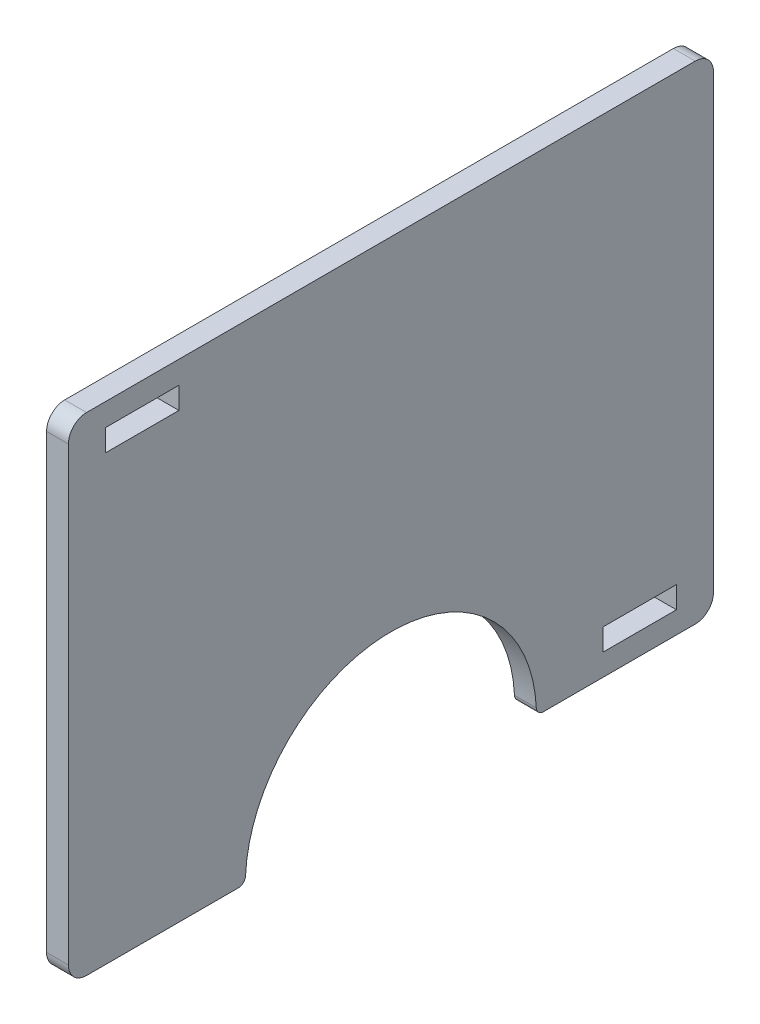
ISO-10303-21;
HEADER;
FILE_DESCRIPTION(('STEP AP214'),'2;1');
FILE_NAME('part.step','',(''),(''),'','','');
FILE_SCHEMA(('AUTOMOTIVE_DESIGN { 1 0 10303 214 1 1 1 1 }'));
ENDSEC;
DATA;
#1=APPLICATION_CONTEXT('core data for automotive mechanical design processes');
#2=APPLICATION_PROTOCOL_DEFINITION('international standard','automotive_design',2000,#1);
#3=PRODUCT_CONTEXT('',#1,'mechanical');
#4=PRODUCT('Part','Part','',(#3));
#5=PRODUCT_RELATED_PRODUCT_CATEGORY('part','',(#4));
#6=PRODUCT_DEFINITION_FORMATION('','',#4);
#7=PRODUCT_DEFINITION_CONTEXT('part definition',#1,'design');
#8=PRODUCT_DEFINITION('design','',#6,#7);
#9=PRODUCT_DEFINITION_SHAPE('','',#8);
#10=(LENGTH_UNIT() NAMED_UNIT(*) SI_UNIT(.MILLI.,.METRE.));
#11=(NAMED_UNIT(*) PLANE_ANGLE_UNIT() SI_UNIT($,.RADIAN.));
#12=(NAMED_UNIT(*) SI_UNIT($,.STERADIAN.) SOLID_ANGLE_UNIT());
#13=UNCERTAINTY_MEASURE_WITH_UNIT(LENGTH_MEASURE(1.E-05),#10,'distance_accuracy_value','');
#14=(GEOMETRIC_REPRESENTATION_CONTEXT(3) GLOBAL_UNCERTAINTY_ASSIGNED_CONTEXT((#13)) GLOBAL_UNIT_ASSIGNED_CONTEXT((#10,
#11,#12)) REPRESENTATION_CONTEXT('',''));
#15=CARTESIAN_POINT('',(0.,0.,0.));
#16=DIRECTION('',(0.,0.,1.));
#17=DIRECTION('',(1.,0.,0.));
#18=AXIS2_PLACEMENT_3D('',#15,#16,#17);
#19=CARTESIAN_POINT('',(3.,-33.5,41.82));
#20=DIRECTION('',(0.,1.,0.));
#21=DIRECTION('',(0.,0.,1.));
#22=AXIS2_PLACEMENT_3D('',#19,#20,#21);
#23=PLANE('',#22);
#24=DIRECTION('',(0.,0.,-1.));
#25=VECTOR('',#24,1.);
#26=CARTESIAN_POINT('',(0.,-33.5,41.82));
#27=LINE('',#26,#25);
#28=CARTESIAN_POINT('',(0.,-33.5,41.82));
#29=VERTEX_POINT('',#28);
#30=CARTESIAN_POINT('',(0.,-33.5,20.9761769634031));
#31=VERTEX_POINT('',#30);
#32=EDGE_CURVE('E274',#29,#31,#27,.T.);
#33=ORIENTED_EDGE('',*,*,#32,.T.);
#34=DIRECTION('',(1.,0.,0.));
#35=VECTOR('',#34,1.);
#36=CARTESIAN_POINT('',(3.,-33.5,20.9761769634031));
#37=LINE('',#36,#35);
#38=CARTESIAN_POINT('',(3.,-33.5,20.9761769634031));
#39=VERTEX_POINT('',#38);
#40=EDGE_CURVE('E11',#31,#39,#37,.T.);
#41=ORIENTED_EDGE('',*,*,#40,.T.);
#42=DIRECTION('',(0.,0.,-1.));
#43=VECTOR('',#42,1.);
#44=CARTESIAN_POINT('',(3.,-33.5,41.82));
#45=LINE('',#44,#43);
#46=CARTESIAN_POINT('',(3.,-33.5,41.82));
#47=VERTEX_POINT('',#46);
#48=EDGE_CURVE('E256',#47,#39,#45,.T.);
#49=ORIENTED_EDGE('',*,*,#48,.F.);
#50=DIRECTION('',(-1.,0.,0.));
#51=VECTOR('',#50,1.);
#52=CARTESIAN_POINT('',(3.,-33.5,41.82));
#53=LINE('',#52,#51);
#54=EDGE_CURVE('E308',#47,#29,#53,.T.);
#55=ORIENTED_EDGE('',*,*,#54,.T.);
#56=EDGE_LOOP('',(#33,#41,#49,#55));
#57=FACE_BOUND('',#56,.T.);
#58=ADVANCED_FACE('F33',(#57),#23,.F.);
#59=CARTESIAN_POINT('',(3.,-31.,41.82));
#60=DIRECTION('',(-1.,0.,0.));
#61=DIRECTION('',(0.,0.,1.));
#62=AXIS2_PLACEMENT_3D('',#59,#60,#61);
#63=CYLINDRICAL_SURFACE('',#62,2.5);
#64=CARTESIAN_POINT('',(0.,-31.,41.82));
#65=DIRECTION('',(1.,0.,0.));
#66=DIRECTION('',(0.,0.,-1.));
#67=AXIS2_PLACEMENT_3D('',#64,#65,#66);
#68=CIRCLE('',#67,2.5);
#69=CARTESIAN_POINT('',(0.,-31.,44.32));
#70=VERTEX_POINT('',#69);
#71=EDGE_CURVE('E250',#70,#29,#68,.T.);
#72=ORIENTED_EDGE('',*,*,#71,.T.);
#73=ORIENTED_EDGE('',*,*,#54,.F.);
#74=CARTESIAN_POINT('',(3.,-31.,41.82));
#75=DIRECTION('',(1.,0.,0.));
#76=DIRECTION('',(0.,0.,-1.));
#77=AXIS2_PLACEMENT_3D('',#74,#75,#76);
#78=CIRCLE('',#77,2.5);
#79=CARTESIAN_POINT('',(3.,-31.,44.32));
#80=VERTEX_POINT('',#79);
#81=EDGE_CURVE('E251',#80,#47,#78,.T.);
#82=ORIENTED_EDGE('',*,*,#81,.F.);
#83=DIRECTION('',(-1.,0.,0.));
#84=VECTOR('',#83,1.);
#85=CARTESIAN_POINT('',(3.,-31.,44.32));
#86=LINE('',#85,#84);
#87=EDGE_CURVE('E270',#80,#70,#86,.T.);
#88=ORIENTED_EDGE('',*,*,#87,.T.);
#89=EDGE_LOOP('',(#72,#73,#82,#88));
#90=FACE_BOUND('',#89,.T.);
#91=ADVANCED_FACE('F344',(#90),#63,.T.);
#92=CARTESIAN_POINT('',(3.,-33.5,-20.976176963403));
#93=VERTEX_POINT('',#92);
#94=CARTESIAN_POINT('',(3.,-33.5,-41.82));
#95=VERTEX_POINT('',#94);
#96=EDGE_CURVE('E254',#93,#95,#45,.T.);
#97=ORIENTED_EDGE('',*,*,#96,.F.);
#98=DIRECTION('',(1.,0.,0.));
#99=VECTOR('',#98,1.);
#100=CARTESIAN_POINT('',(3.,-33.5,-20.976176963403));
#101=LINE('',#100,#99);
#102=CARTESIAN_POINT('',(0.,-33.5,-20.976176963403));
#103=VERTEX_POINT('',#102);
#104=EDGE_CURVE('E311',#93,#103,#101,.F.);
#105=ORIENTED_EDGE('',*,*,#104,.T.);
#106=CARTESIAN_POINT('',(0.,-33.5,-41.82));
#107=VERTEX_POINT('',#106);
#108=EDGE_CURVE('E273',#103,#107,#27,.T.);
#109=ORIENTED_EDGE('',*,*,#108,.T.);
#110=DIRECTION('',(-1.,0.,0.));
#111=VECTOR('',#110,1.);
#112=CARTESIAN_POINT('',(3.,-33.5,-41.82));
#113=LINE('',#112,#111);
#114=EDGE_CURVE('E305',#95,#107,#113,.T.);
#115=ORIENTED_EDGE('',*,*,#114,.F.);
#116=EDGE_LOOP('',(#97,#105,#109,#115));
#117=FACE_BOUND('',#116,.T.);
#118=ADVANCED_FACE('F330',(#117),#23,.F.);
#119=CARTESIAN_POINT('',(3.,-31.,-41.82));
#120=DIRECTION('',(-1.,0.,0.));
#121=DIRECTION('',(0.,0.,1.));
#122=AXIS2_PLACEMENT_3D('',#119,#120,#121);
#123=CYLINDRICAL_SURFACE('',#122,2.50000000000001);
#124=CARTESIAN_POINT('',(0.,-31.,-41.82));
#125=DIRECTION('',(1.,0.,0.));
#126=DIRECTION('',(0.,0.,-1.));
#127=AXIS2_PLACEMENT_3D('',#124,#125,#126);
#128=CIRCLE('',#127,2.50000000000001);
#129=CARTESIAN_POINT('',(0.,-31.,-44.32));
#130=VERTEX_POINT('',#129);
#131=EDGE_CURVE('E277',#107,#130,#128,.T.);
#132=ORIENTED_EDGE('',*,*,#131,.T.);
#133=DIRECTION('',(-1.,0.,0.));
#134=VECTOR('',#133,1.);
#135=CARTESIAN_POINT('',(3.,-31.,-44.32));
#136=LINE('',#135,#134);
#137=CARTESIAN_POINT('',(3.,-31.,-44.32));
#138=VERTEX_POINT('',#137);
#139=EDGE_CURVE('E302',#138,#130,#136,.T.);
#140=ORIENTED_EDGE('',*,*,#139,.F.);
#141=CARTESIAN_POINT('',(3.,-31.,-41.82));
#142=DIRECTION('',(1.,0.,0.));
#143=DIRECTION('',(0.,0.,-1.));
#144=AXIS2_PLACEMENT_3D('',#141,#142,#143);
#145=CIRCLE('',#144,2.50000000000001);
#146=EDGE_CURVE('E258',#95,#138,#145,.T.);
#147=ORIENTED_EDGE('',*,*,#146,.F.);
#148=ORIENTED_EDGE('',*,*,#114,.T.);
#149=EDGE_LOOP('',(#132,#140,#147,#148));
#150=FACE_BOUND('',#149,.T.);
#151=ADVANCED_FACE('F372',(#150),#123,.T.);
#152=CARTESIAN_POINT('',(3.,31.,-44.32));
#153=DIRECTION('',(0.,0.,1.));
#154=DIRECTION('',(1.,0.,0.));
#155=AXIS2_PLACEMENT_3D('',#152,#153,#154);
#156=PLANE('',#155);
#157=DIRECTION('',(0.,1.,0.));
#158=VECTOR('',#157,1.);
#159=CARTESIAN_POINT('',(0.,31.,-44.32));
#160=LINE('',#159,#158);
#161=CARTESIAN_POINT('',(0.,31.,-44.32));
#162=VERTEX_POINT('',#161);
#163=EDGE_CURVE('E279',#130,#162,#160,.T.);
#164=ORIENTED_EDGE('',*,*,#163,.T.);
#165=DIRECTION('',(-1.,0.,0.));
#166=VECTOR('',#165,1.);
#167=CARTESIAN_POINT('',(3.,31.,-44.32));
#168=LINE('',#167,#166);
#169=CARTESIAN_POINT('',(3.,31.,-44.32));
#170=VERTEX_POINT('',#169);
#171=EDGE_CURVE('E299',#170,#162,#168,.T.);
#172=ORIENTED_EDGE('',*,*,#171,.F.);
#173=DIRECTION('',(0.,1.,0.));
#174=VECTOR('',#173,1.);
#175=CARTESIAN_POINT('',(3.,31.,-44.32));
#176=LINE('',#175,#174);
#177=EDGE_CURVE('E260',#138,#170,#176,.T.);
#178=ORIENTED_EDGE('',*,*,#177,.F.);
#179=ORIENTED_EDGE('',*,*,#139,.T.);
#180=EDGE_LOOP('',(#164,#172,#178,#179));
#181=FACE_BOUND('',#180,.T.);
#182=ADVANCED_FACE('F369',(#181),#156,.F.);
#183=CARTESIAN_POINT('',(3.,31.,-41.82));
#184=DIRECTION('',(-1.,0.,0.));
#185=DIRECTION('',(0.,0.,1.));
#186=AXIS2_PLACEMENT_3D('',#183,#184,#185);
#187=CYLINDRICAL_SURFACE('',#186,2.5);
#188=CARTESIAN_POINT('',(0.,31.,-41.82));
#189=DIRECTION('',(1.,0.,0.));
#190=DIRECTION('',(0.,0.,1.));
#191=AXIS2_PLACEMENT_3D('',#188,#189,#190);
#192=CIRCLE('',#191,2.5);
#193=CARTESIAN_POINT('',(0.,33.5,-41.82));
#194=VERTEX_POINT('',#193);
#195=EDGE_CURVE('E281',#162,#194,#192,.T.);
#196=ORIENTED_EDGE('',*,*,#195,.T.);
#197=DIRECTION('',(-1.,0.,0.));
#198=VECTOR('',#197,1.);
#199=CARTESIAN_POINT('',(3.,33.5,-41.82));
#200=LINE('',#199,#198);
#201=CARTESIAN_POINT('',(3.,33.5,-41.82));
#202=VERTEX_POINT('',#201);
#203=EDGE_CURVE('E296',#202,#194,#200,.T.);
#204=ORIENTED_EDGE('',*,*,#203,.F.);
#205=CARTESIAN_POINT('',(3.,31.,-41.82));
#206=DIRECTION('',(1.,0.,0.));
#207=DIRECTION('',(0.,0.,1.));
#208=AXIS2_PLACEMENT_3D('',#205,#206,#207);
#209=CIRCLE('',#208,2.5);
#210=EDGE_CURVE('E262',#170,#202,#209,.T.);
#211=ORIENTED_EDGE('',*,*,#210,.F.);
#212=ORIENTED_EDGE('',*,*,#171,.T.);
#213=EDGE_LOOP('',(#196,#204,#211,#212));
#214=FACE_BOUND('',#213,.T.);
#215=ADVANCED_FACE('F364',(#214),#187,.T.);
#216=CARTESIAN_POINT('',(3.,33.5,41.82));
#217=DIRECTION('',(0.,-1.,0.));
#218=DIRECTION('',(0.,0.,-1.));
#219=AXIS2_PLACEMENT_3D('',#216,#217,#218);
#220=PLANE('',#219);
#221=DIRECTION('',(0.,0.,1.));
#222=VECTOR('',#221,1.);
#223=CARTESIAN_POINT('',(0.,33.5,41.82));
#224=LINE('',#223,#222);
#225=CARTESIAN_POINT('',(0.,33.5,41.82));
#226=VERTEX_POINT('',#225);
#227=EDGE_CURVE('E283',#194,#226,#224,.T.);
#228=ORIENTED_EDGE('',*,*,#227,.T.);
#229=DIRECTION('',(-1.,0.,0.));
#230=VECTOR('',#229,1.);
#231=CARTESIAN_POINT('',(3.,33.5,41.82));
#232=LINE('',#231,#230);
#233=CARTESIAN_POINT('',(3.,33.5,41.82));
#234=VERTEX_POINT('',#233);
#235=EDGE_CURVE('E293',#234,#226,#232,.T.);
#236=ORIENTED_EDGE('',*,*,#235,.F.);
#237=DIRECTION('',(0.,0.,1.));
#238=VECTOR('',#237,1.);
#239=CARTESIAN_POINT('',(3.,33.5,41.82));
#240=LINE('',#239,#238);
#241=EDGE_CURVE('E264',#202,#234,#240,.T.);
#242=ORIENTED_EDGE('',*,*,#241,.F.);
#243=ORIENTED_EDGE('',*,*,#203,.T.);
#244=EDGE_LOOP('',(#228,#236,#242,#243));
#245=FACE_BOUND('',#244,.T.);
#246=ADVANCED_FACE('F359',(#245),#220,.F.);
#247=CARTESIAN_POINT('',(3.,31.,41.82));
#248=DIRECTION('',(-1.,0.,0.));
#249=DIRECTION('',(0.,0.,1.));
#250=AXIS2_PLACEMENT_3D('',#247,#248,#249);
#251=CYLINDRICAL_SURFACE('',#250,2.5);
#252=CARTESIAN_POINT('',(0.,31.,41.82));
#253=DIRECTION('',(1.,0.,0.));
#254=DIRECTION('',(0.,0.,-1.));
#255=AXIS2_PLACEMENT_3D('',#252,#253,#254);
#256=CIRCLE('',#255,2.5);
#257=CARTESIAN_POINT('',(0.,31.,44.32));
#258=VERTEX_POINT('',#257);
#259=EDGE_CURVE('E285',#226,#258,#256,.T.);
#260=ORIENTED_EDGE('',*,*,#259,.T.);
#261=DIRECTION('',(-1.,0.,0.));
#262=VECTOR('',#261,1.);
#263=CARTESIAN_POINT('',(3.,31.,44.32));
#264=LINE('',#263,#262);
#265=CARTESIAN_POINT('',(3.,31.,44.32));
#266=VERTEX_POINT('',#265);
#267=EDGE_CURVE('E290',#266,#258,#264,.T.);
#268=ORIENTED_EDGE('',*,*,#267,.F.);
#269=CARTESIAN_POINT('',(3.,31.,41.82));
#270=DIRECTION('',(1.,0.,0.));
#271=DIRECTION('',(0.,0.,-1.));
#272=AXIS2_PLACEMENT_3D('',#269,#270,#271);
#273=CIRCLE('',#272,2.5);
#274=EDGE_CURVE('E266',#234,#266,#273,.T.);
#275=ORIENTED_EDGE('',*,*,#274,.F.);
#276=ORIENTED_EDGE('',*,*,#235,.T.);
#277=EDGE_LOOP('',(#260,#268,#275,#276));
#278=FACE_BOUND('',#277,.T.);
#279=ADVANCED_FACE('F355',(#278),#251,.T.);
#280=CARTESIAN_POINT('',(3.,31.,44.32));
#281=DIRECTION('',(0.,0.,-1.));
#282=DIRECTION('',(0.,1.,0.));
#283=AXIS2_PLACEMENT_3D('',#280,#281,#282);
#284=PLANE('',#283);
#285=DIRECTION('',(0.,-1.,0.));
#286=VECTOR('',#285,1.);
#287=CARTESIAN_POINT('',(0.,31.,44.32));
#288=LINE('',#287,#286);
#289=EDGE_CURVE('E255',#258,#70,#288,.T.);
#290=ORIENTED_EDGE('',*,*,#289,.T.);
#291=ORIENTED_EDGE('',*,*,#87,.F.);
#292=DIRECTION('',(0.,-1.,0.));
#293=VECTOR('',#292,1.);
#294=CARTESIAN_POINT('',(3.,31.,44.32));
#295=LINE('',#294,#293);
#296=EDGE_CURVE('E268',#266,#80,#295,.T.);
#297=ORIENTED_EDGE('',*,*,#296,.F.);
#298=ORIENTED_EDGE('',*,*,#267,.T.);
#299=EDGE_LOOP('',(#290,#291,#297,#298));
#300=FACE_BOUND('',#299,.T.);
#301=ADVANCED_FACE('F350',(#300),#284,.F.);
#302=CARTESIAN_POINT('',(3.,-31.,41.82));
#303=DIRECTION('',(1.,0.,0.));
#304=DIRECTION('',(0.,0.,-1.));
#305=AXIS2_PLACEMENT_3D('',#302,#303,#304);
#306=PLANE('',#305);
#307=DIRECTION('',(0.,-1.,0.));
#308=VECTOR('',#307,1.);
#309=CARTESIAN_POINT('',(3.,-31.,39.23));
#310=LINE('',#309,#308);
#311=CARTESIAN_POINT('',(3.,30.4,39.23));
#312=VERTEX_POINT('',#311);
#313=CARTESIAN_POINT('',(3.,27.4,39.23));
#314=VERTEX_POINT('',#313);
#315=EDGE_CURVE('E247',#312,#314,#310,.T.);
#316=ORIENTED_EDGE('',*,*,#315,.F.);
#317=DIRECTION('',(0.,0.,1.));
#318=VECTOR('',#317,1.);
#319=CARTESIAN_POINT('',(3.,30.4,41.82));
#320=LINE('',#319,#318);
#321=CARTESIAN_POINT('',(3.,30.4,29.13));
#322=VERTEX_POINT('',#321);
#323=EDGE_CURVE('E245',#322,#312,#320,.T.);
#324=ORIENTED_EDGE('',*,*,#323,.F.);
#325=DIRECTION('',(0.,1.,0.));
#326=VECTOR('',#325,1.);
#327=CARTESIAN_POINT('',(3.,-31.,29.1300000000001));
#328=LINE('',#327,#326);
#329=CARTESIAN_POINT('',(3.,27.4,29.13));
#330=VERTEX_POINT('',#329);
#331=EDGE_CURVE('E243',#330,#322,#328,.T.);
#332=ORIENTED_EDGE('',*,*,#331,.F.);
#333=DIRECTION('',(0.,0.,-1.));
#334=VECTOR('',#333,1.);
#335=CARTESIAN_POINT('',(3.,27.4,41.82));
#336=LINE('',#335,#334);
#337=EDGE_CURVE('E241',#314,#330,#336,.T.);
#338=ORIENTED_EDGE('',*,*,#337,.F.);
#339=EDGE_LOOP('',(#316,#324,#332,#338));
#340=FACE_BOUND('',#339,.T.);
#341=DIRECTION('',(0.,1.,0.));
#342=VECTOR('',#341,1.);
#343=CARTESIAN_POINT('',(3.,-31.,-39.23));
#344=LINE('',#343,#342);
#345=CARTESIAN_POINT('',(3.,-30.5,-39.23));
#346=VERTEX_POINT('',#345);
#347=CARTESIAN_POINT('',(3.,-27.5,-39.23));
#348=VERTEX_POINT('',#347);
#349=EDGE_CURVE('E178',#346,#348,#344,.T.);
#350=ORIENTED_EDGE('',*,*,#349,.F.);
#351=DIRECTION('',(0.,0.,-1.));
#352=VECTOR('',#351,1.);
#353=CARTESIAN_POINT('',(3.,-30.5,41.82));
#354=LINE('',#353,#352);
#355=CARTESIAN_POINT('',(3.,-30.5,-29.13));
#356=VERTEX_POINT('',#355);
#357=EDGE_CURVE('E238',#356,#346,#354,.T.);
#358=ORIENTED_EDGE('',*,*,#357,.F.);
#359=DIRECTION('',(0.,-1.,0.));
#360=VECTOR('',#359,1.);
#361=CARTESIAN_POINT('',(3.,-31.,-29.13));
#362=LINE('',#361,#360);
#363=CARTESIAN_POINT('',(3.,-27.5,-29.13));
#364=VERTEX_POINT('',#363);
#365=EDGE_CURVE('E236',#364,#356,#362,.T.);
#366=ORIENTED_EDGE('',*,*,#365,.F.);
#367=DIRECTION('',(0.,0.,1.));
#368=VECTOR('',#367,1.);
#369=CARTESIAN_POINT('',(3.,-27.5,41.82));
#370=LINE('',#369,#368);
#371=EDGE_CURVE('E234',#348,#364,#370,.T.);
#372=ORIENTED_EDGE('',*,*,#371,.F.);
#373=EDGE_LOOP('',(#350,#358,#366,#372));
#374=FACE_BOUND('',#373,.T.);
#375=CARTESIAN_POINT('',(3.,-33.5,0.));
#376=DIRECTION('',(1.,0.,0.));
#377=DIRECTION('',(0.,0.,-1.));
#378=AXIS2_PLACEMENT_3D('',#375,#376,#377);
#379=CIRCLE('',#378,20.);
#380=CARTESIAN_POINT('',(3.,-32.5476190476191,-19.9773113937172));
#381=VERTEX_POINT('',#380);
#382=CARTESIAN_POINT('',(3.,-32.5476190476191,19.9773113937172));
#383=VERTEX_POINT('',#382);
#384=EDGE_CURVE('E232',#381,#383,#379,.T.);
#385=ORIENTED_EDGE('',*,*,#384,.F.);
#386=CARTESIAN_POINT('',(3.,-32.5,-20.976176963403));
#387=DIRECTION('',(1.,0.,0.));
#388=DIRECTION('',(0.,0.,-1.));
#389=AXIS2_PLACEMENT_3D('',#386,#387,#388);
#390=CIRCLE('',#389,1.);
#391=EDGE_CURVE('E41',#381,#93,#390,.T.);
#392=ORIENTED_EDGE('',*,*,#391,.T.);
#393=ORIENTED_EDGE('',*,*,#96,.T.);
#394=ORIENTED_EDGE('',*,*,#146,.T.);
#395=ORIENTED_EDGE('',*,*,#177,.T.);
#396=ORIENTED_EDGE('',*,*,#210,.T.);
#397=ORIENTED_EDGE('',*,*,#241,.T.);
#398=ORIENTED_EDGE('',*,*,#274,.T.);
#399=ORIENTED_EDGE('',*,*,#296,.T.);
#400=ORIENTED_EDGE('',*,*,#81,.T.);
#401=ORIENTED_EDGE('',*,*,#48,.T.);
#402=CARTESIAN_POINT('',(3.,-32.5,20.9761769634031));
#403=DIRECTION('',(1.,0.,0.));
#404=DIRECTION('',(0.,0.,-1.));
#405=AXIS2_PLACEMENT_3D('',#402,#403,#404);
#406=CIRCLE('',#405,1.);
#407=EDGE_CURVE('E48',#39,#383,#406,.T.);
#408=ORIENTED_EDGE('',*,*,#407,.T.);
#409=EDGE_LOOP('',(#385,#392,#393,#394,#395,#396,#397,#398,#399,#400,#401,#408));
#410=FACE_BOUND('',#409,.T.);
#411=ADVANCED_FACE('F324',(#340,#374,#410),#306,.T.);
#412=CARTESIAN_POINT('',(0.,-31.,41.82));
#413=DIRECTION('',(1.,0.,0.));
#414=DIRECTION('',(0.,0.,-1.));
#415=AXIS2_PLACEMENT_3D('',#412,#413,#414);
#416=PLANE('',#415);
#417=DIRECTION('',(0.,0.,1.));
#418=VECTOR('',#417,1.);
#419=CARTESIAN_POINT('',(0.,30.4,39.23));
#420=LINE('',#419,#418);
#421=CARTESIAN_POINT('',(0.,30.4,29.13));
#422=VERTEX_POINT('',#421);
#423=CARTESIAN_POINT('',(0.,30.4,39.23));
#424=VERTEX_POINT('',#423);
#425=EDGE_CURVE('E220',#422,#424,#420,.T.);
#426=ORIENTED_EDGE('',*,*,#425,.T.);
#427=DIRECTION('',(0.,-1.,0.));
#428=VECTOR('',#427,1.);
#429=CARTESIAN_POINT('',(0.,27.4,39.23));
#430=LINE('',#429,#428);
#431=CARTESIAN_POINT('',(0.,27.4,39.23));
#432=VERTEX_POINT('',#431);
#433=EDGE_CURVE('E211',#424,#432,#430,.T.);
#434=ORIENTED_EDGE('',*,*,#433,.T.);
#435=DIRECTION('',(0.,0.,-1.));
#436=VECTOR('',#435,1.);
#437=CARTESIAN_POINT('',(0.,27.4,39.23));
#438=LINE('',#437,#436);
#439=CARTESIAN_POINT('',(0.,27.4,29.13));
#440=VERTEX_POINT('',#439);
#441=EDGE_CURVE('E214',#432,#440,#438,.T.);
#442=ORIENTED_EDGE('',*,*,#441,.T.);
#443=DIRECTION('',(0.,1.,0.));
#444=VECTOR('',#443,1.);
#445=CARTESIAN_POINT('',(0.,27.4,29.13));
#446=LINE('',#445,#444);
#447=EDGE_CURVE('E217',#440,#422,#446,.T.);
#448=ORIENTED_EDGE('',*,*,#447,.T.);
#449=EDGE_LOOP('',(#426,#434,#442,#448));
#450=FACE_BOUND('',#449,.T.);
#451=DIRECTION('',(0.,0.,-1.));
#452=VECTOR('',#451,1.);
#453=CARTESIAN_POINT('',(0.,-30.5,-39.23));
#454=LINE('',#453,#452);
#455=CARTESIAN_POINT('',(0.,-30.5,-29.13));
#456=VERTEX_POINT('',#455);
#457=CARTESIAN_POINT('',(0.,-30.5,-39.23));
#458=VERTEX_POINT('',#457);
#459=EDGE_CURVE('E182',#456,#458,#454,.T.);
#460=ORIENTED_EDGE('',*,*,#459,.T.);
#461=DIRECTION('',(0.,1.,0.));
#462=VECTOR('',#461,1.);
#463=CARTESIAN_POINT('',(0.,-30.5,-39.23));
#464=LINE('',#463,#462);
#465=CARTESIAN_POINT('',(0.,-27.5,-39.23));
#466=VERTEX_POINT('',#465);
#467=EDGE_CURVE('E175',#458,#466,#464,.T.);
#468=ORIENTED_EDGE('',*,*,#467,.T.);
#469=DIRECTION('',(0.,0.,1.));
#470=VECTOR('',#469,1.);
#471=CARTESIAN_POINT('',(0.,-27.5,-39.23));
#472=LINE('',#471,#470);
#473=CARTESIAN_POINT('',(0.,-27.5,-29.13));
#474=VERTEX_POINT('',#473);
#475=EDGE_CURVE('E186',#466,#474,#472,.T.);
#476=ORIENTED_EDGE('',*,*,#475,.T.);
#477=DIRECTION('',(0.,-1.,0.));
#478=VECTOR('',#477,1.);
#479=CARTESIAN_POINT('',(0.,-30.5,-29.13));
#480=LINE('',#479,#478);
#481=EDGE_CURVE('E191',#474,#456,#480,.T.);
#482=ORIENTED_EDGE('',*,*,#481,.T.);
#483=EDGE_LOOP('',(#460,#468,#476,#482));
#484=FACE_BOUND('',#483,.T.);
#485=ORIENTED_EDGE('',*,*,#108,.F.);
#486=CARTESIAN_POINT('',(0.,-32.5,-20.976176963403));
#487=DIRECTION('',(1.,0.,0.));
#488=DIRECTION('',(0.,0.,-1.));
#489=AXIS2_PLACEMENT_3D('',#486,#487,#488);
#490=CIRCLE('',#489,1.);
#491=CARTESIAN_POINT('',(0.,-32.5476190476191,-19.9773113937172));
#492=VERTEX_POINT('',#491);
#493=EDGE_CURVE('E316',#103,#492,#490,.F.);
#494=ORIENTED_EDGE('',*,*,#493,.T.);
#495=CARTESIAN_POINT('',(0.,-33.5,0.));
#496=DIRECTION('',(1.,0.,0.));
#497=DIRECTION('',(0.,0.,-1.));
#498=AXIS2_PLACEMENT_3D('',#495,#496,#497);
#499=CIRCLE('',#498,20.);
#500=CARTESIAN_POINT('',(0.,-32.5476190476191,19.9773113937172));
#501=VERTEX_POINT('',#500);
#502=EDGE_CURVE('E206',#492,#501,#499,.T.);
#503=ORIENTED_EDGE('',*,*,#502,.T.);
#504=CARTESIAN_POINT('',(0.,-32.5,20.9761769634031));
#505=DIRECTION('',(1.,0.,0.));
#506=DIRECTION('',(0.,0.,-1.));
#507=AXIS2_PLACEMENT_3D('',#504,#505,#506);
#508=CIRCLE('',#507,1.);
#509=EDGE_CURVE('E314',#501,#31,#508,.F.);
#510=ORIENTED_EDGE('',*,*,#509,.T.);
#511=ORIENTED_EDGE('',*,*,#32,.F.);
#512=ORIENTED_EDGE('',*,*,#71,.F.);
#513=ORIENTED_EDGE('',*,*,#289,.F.);
#514=ORIENTED_EDGE('',*,*,#259,.F.);
#515=ORIENTED_EDGE('',*,*,#227,.F.);
#516=ORIENTED_EDGE('',*,*,#195,.F.);
#517=ORIENTED_EDGE('',*,*,#163,.F.);
#518=ORIENTED_EDGE('',*,*,#131,.F.);
#519=EDGE_LOOP('',(#485,#494,#503,#510,#511,#512,#513,#514,#515,#516,#517,#518));
#520=FACE_BOUND('',#519,.T.);
#521=ADVANCED_FACE('F193',(#450,#484,#520),#416,.F.);
#522=CARTESIAN_POINT('',(0.,-33.5,0.));
#523=DIRECTION('',(1.,0.,0.));
#524=DIRECTION('',(0.,0.,-1.));
#525=AXIS2_PLACEMENT_3D('',#522,#523,#524);
#526=CYLINDRICAL_SURFACE('',#525,20.);
#527=ORIENTED_EDGE('',*,*,#502,.F.);
#528=DIRECTION('',(1.,0.,0.));
#529=VECTOR('',#528,1.);
#530=CARTESIAN_POINT('',(0.,-32.5476190476191,-19.9773113937172));
#531=LINE('',#530,#529);
#532=EDGE_CURVE('E320',#492,#381,#531,.T.);
#533=ORIENTED_EDGE('',*,*,#532,.T.);
#534=ORIENTED_EDGE('',*,*,#384,.T.);
#535=DIRECTION('',(1.,0.,0.));
#536=VECTOR('',#535,1.);
#537=CARTESIAN_POINT('',(0.,-32.5476190476191,19.9773113937172));
#538=LINE('',#537,#536);
#539=EDGE_CURVE('E318',#383,#501,#538,.F.);
#540=ORIENTED_EDGE('',*,*,#539,.T.);
#541=EDGE_LOOP('',(#527,#533,#534,#540));
#542=FACE_BOUND('',#541,.T.);
#543=ADVANCED_FACE('F338',(#542),#526,.F.);
#544=CARTESIAN_POINT('',(0.,-30.5,-39.23));
#545=DIRECTION('',(0.,0.,-1.));
#546=DIRECTION('',(-1.,0.,0.));
#547=AXIS2_PLACEMENT_3D('',#544,#545,#546);
#548=PLANE('',#547);
#549=ORIENTED_EDGE('',*,*,#349,.T.);
#550=DIRECTION('',(1.,0.,0.));
#551=VECTOR('',#550,1.);
#552=CARTESIAN_POINT('',(0.,-27.5,-39.23));
#553=LINE('',#552,#551);
#554=EDGE_CURVE('E170',#466,#348,#553,.T.);
#555=ORIENTED_EDGE('',*,*,#554,.F.);
#556=ORIENTED_EDGE('',*,*,#467,.F.);
#557=DIRECTION('',(1.,0.,0.));
#558=VECTOR('',#557,1.);
#559=CARTESIAN_POINT('',(0.,-30.5,-39.23));
#560=LINE('',#559,#558);
#561=EDGE_CURVE('E204',#458,#346,#560,.T.);
#562=ORIENTED_EDGE('',*,*,#561,.T.);
#563=EDGE_LOOP('',(#549,#555,#556,#562));
#564=FACE_BOUND('',#563,.T.);
#565=ADVANCED_FACE('F172',(#564),#548,.F.);
#566=CARTESIAN_POINT('',(0.,-30.5,-39.23));
#567=DIRECTION('',(0.,-1.,0.));
#568=DIRECTION('',(0.,0.,-1.));
#569=AXIS2_PLACEMENT_3D('',#566,#567,#568);
#570=PLANE('',#569);
#571=ORIENTED_EDGE('',*,*,#357,.T.);
#572=ORIENTED_EDGE('',*,*,#561,.F.);
#573=ORIENTED_EDGE('',*,*,#459,.F.);
#574=DIRECTION('',(1.,0.,0.));
#575=VECTOR('',#574,1.);
#576=CARTESIAN_POINT('',(0.,-30.5,-29.13));
#577=LINE('',#576,#575);
#578=EDGE_CURVE('E207',#456,#356,#577,.T.);
#579=ORIENTED_EDGE('',*,*,#578,.T.);
#580=EDGE_LOOP('',(#571,#572,#573,#579));
#581=FACE_BOUND('',#580,.T.);
#582=ADVANCED_FACE('F457',(#581),#570,.F.);
#583=CARTESIAN_POINT('',(0.,-30.5,-29.13));
#584=DIRECTION('',(0.,0.,1.));
#585=DIRECTION('',(1.,0.,0.));
#586=AXIS2_PLACEMENT_3D('',#583,#584,#585);
#587=PLANE('',#586);
#588=ORIENTED_EDGE('',*,*,#365,.T.);
#589=ORIENTED_EDGE('',*,*,#578,.F.);
#590=ORIENTED_EDGE('',*,*,#481,.F.);
#591=DIRECTION('',(1.,0.,0.));
#592=VECTOR('',#591,1.);
#593=CARTESIAN_POINT('',(0.,-27.5,-29.13));
#594=LINE('',#593,#592);
#595=EDGE_CURVE('E181',#474,#364,#594,.T.);
#596=ORIENTED_EDGE('',*,*,#595,.T.);
#597=EDGE_LOOP('',(#588,#589,#590,#596));
#598=FACE_BOUND('',#597,.T.);
#599=ADVANCED_FACE('F464',(#598),#587,.F.);
#600=CARTESIAN_POINT('',(0.,-27.5,-39.23));
#601=DIRECTION('',(0.,1.,0.));
#602=DIRECTION('',(0.,0.,1.));
#603=AXIS2_PLACEMENT_3D('',#600,#601,#602);
#604=PLANE('',#603);
#605=ORIENTED_EDGE('',*,*,#371,.T.);
#606=ORIENTED_EDGE('',*,*,#595,.F.);
#607=ORIENTED_EDGE('',*,*,#475,.F.);
#608=ORIENTED_EDGE('',*,*,#554,.T.);
#609=EDGE_LOOP('',(#605,#606,#607,#608));
#610=FACE_BOUND('',#609,.T.);
#611=ADVANCED_FACE('F187',(#610),#604,.F.);
#612=CARTESIAN_POINT('',(0.,27.4,39.23));
#613=DIRECTION('',(0.,0.,1.));
#614=DIRECTION('',(1.,0.,0.));
#615=AXIS2_PLACEMENT_3D('',#612,#613,#614);
#616=PLANE('',#615);
#617=ORIENTED_EDGE('',*,*,#315,.T.);
#618=DIRECTION('',(1.,0.,0.));
#619=VECTOR('',#618,1.);
#620=CARTESIAN_POINT('',(0.,27.4,39.23));
#621=LINE('',#620,#619);
#622=EDGE_CURVE('E222',#432,#314,#621,.T.);
#623=ORIENTED_EDGE('',*,*,#622,.F.);
#624=ORIENTED_EDGE('',*,*,#433,.F.);
#625=DIRECTION('',(1.,0.,0.));
#626=VECTOR('',#625,1.);
#627=CARTESIAN_POINT('',(0.,30.4,39.23));
#628=LINE('',#627,#626);
#629=EDGE_CURVE('E196',#424,#312,#628,.T.);
#630=ORIENTED_EDGE('',*,*,#629,.T.);
#631=EDGE_LOOP('',(#617,#623,#624,#630));
#632=FACE_BOUND('',#631,.T.);
#633=ADVANCED_FACE('F403',(#632),#616,.F.);
#634=CARTESIAN_POINT('',(0.,30.4,39.23));
#635=DIRECTION('',(0.,1.,0.));
#636=DIRECTION('',(0.,0.,1.));
#637=AXIS2_PLACEMENT_3D('',#634,#635,#636);
#638=PLANE('',#637);
#639=ORIENTED_EDGE('',*,*,#323,.T.);
#640=ORIENTED_EDGE('',*,*,#629,.F.);
#641=ORIENTED_EDGE('',*,*,#425,.F.);
#642=DIRECTION('',(1.,0.,0.));
#643=VECTOR('',#642,1.);
#644=CARTESIAN_POINT('',(0.,30.4,29.13));
#645=LINE('',#644,#643);
#646=EDGE_CURVE('E199',#422,#322,#645,.T.);
#647=ORIENTED_EDGE('',*,*,#646,.T.);
#648=EDGE_LOOP('',(#639,#640,#641,#647));
#649=FACE_BOUND('',#648,.T.);
#650=ADVANCED_FACE('F398',(#649),#638,.F.);
#651=CARTESIAN_POINT('',(0.,27.4,29.13));
#652=DIRECTION('',(0.,0.,-1.));
#653=DIRECTION('',(0.,1.,0.));
#654=AXIS2_PLACEMENT_3D('',#651,#652,#653);
#655=PLANE('',#654);
#656=ORIENTED_EDGE('',*,*,#331,.T.);
#657=ORIENTED_EDGE('',*,*,#646,.F.);
#658=ORIENTED_EDGE('',*,*,#447,.F.);
#659=DIRECTION('',(1.,0.,0.));
#660=VECTOR('',#659,1.);
#661=CARTESIAN_POINT('',(0.,27.4,29.13));
#662=LINE('',#661,#660);
#663=EDGE_CURVE('E226',#440,#330,#662,.T.);
#664=ORIENTED_EDGE('',*,*,#663,.T.);
#665=EDGE_LOOP('',(#656,#657,#658,#664));
#666=FACE_BOUND('',#665,.T.);
#667=ADVANCED_FACE('F392',(#666),#655,.F.);
#668=CARTESIAN_POINT('',(0.,27.4,39.23));
#669=DIRECTION('',(0.,-1.,0.));
#670=DIRECTION('',(0.,0.,-1.));
#671=AXIS2_PLACEMENT_3D('',#668,#669,#670);
#672=PLANE('',#671);
#673=ORIENTED_EDGE('',*,*,#337,.T.);
#674=ORIENTED_EDGE('',*,*,#663,.F.);
#675=ORIENTED_EDGE('',*,*,#441,.F.);
#676=ORIENTED_EDGE('',*,*,#622,.T.);
#677=EDGE_LOOP('',(#673,#674,#675,#676));
#678=FACE_BOUND('',#677,.T.);
#679=ADVANCED_FACE('F387',(#678),#672,.F.);
#680=CARTESIAN_POINT('',(0.,-32.5,-20.976176963403));
#681=DIRECTION('',(1.,0.,0.));
#682=DIRECTION('',(0.,0.,-1.));
#683=AXIS2_PLACEMENT_3D('',#680,#681,#682);
#684=CYLINDRICAL_SURFACE('',#683,1.);
#685=ORIENTED_EDGE('',*,*,#391,.F.);
#686=ORIENTED_EDGE('',*,*,#532,.F.);
#687=ORIENTED_EDGE('',*,*,#493,.F.);
#688=ORIENTED_EDGE('',*,*,#104,.F.);
#689=EDGE_LOOP('',(#685,#686,#687,#688));
#690=FACE_BOUND('',#689,.T.);
#691=ADVANCED_FACE('F333',(#690),#684,.T.);
#692=CARTESIAN_POINT('',(0.,-32.5,20.9761769634031));
#693=DIRECTION('',(1.,0.,0.));
#694=DIRECTION('',(0.,0.,-1.));
#695=AXIS2_PLACEMENT_3D('',#692,#693,#694);
#696=CYLINDRICAL_SURFACE('',#695,1.);
#697=ORIENTED_EDGE('',*,*,#509,.F.);
#698=ORIENTED_EDGE('',*,*,#539,.F.);
#699=ORIENTED_EDGE('',*,*,#407,.F.);
#700=ORIENTED_EDGE('',*,*,#40,.F.);
#701=EDGE_LOOP('',(#697,#698,#699,#700));
#702=FACE_BOUND('',#701,.T.);
#703=ADVANCED_FACE('F35',(#702),#696,.T.);
#704=CLOSED_SHELL('',(#58,#91,#118,#151,#182,#215,#246,#279,#301,#411,#521,#543,#565,#582,#599,
#611,#633,#650,#667,#679,#691,#703));
#705=MANIFOLD_SOLID_BREP('B2',#704);
#706=ADVANCED_BREP_SHAPE_REPRESENTATION('',(#18,#705),#14);
#707=SHAPE_DEFINITION_REPRESENTATION(#9,#706);
ENDSEC;
END-ISO-10303-21;
